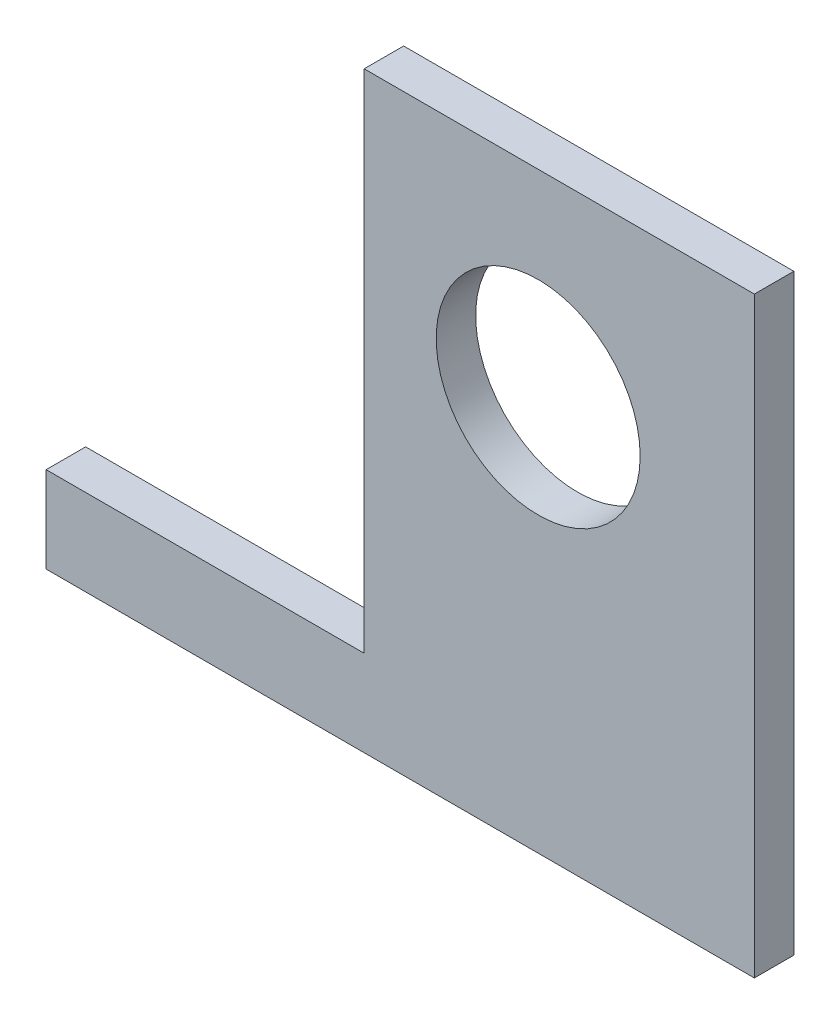
ISO-10303-21;
HEADER;
FILE_DESCRIPTION(('STEP AP214'),'2;1');
FILE_NAME('part.step','',(''),(''),'','','');
FILE_SCHEMA(('AUTOMOTIVE_DESIGN { 1 0 10303 214 1 1 1 1 }'));
ENDSEC;
DATA;
#1=APPLICATION_CONTEXT('core data for automotive mechanical design processes');
#2=APPLICATION_PROTOCOL_DEFINITION('international standard','automotive_design',2000,#1);
#3=PRODUCT_CONTEXT('',#1,'mechanical');
#4=PRODUCT('Part','Part','',(#3));
#5=PRODUCT_RELATED_PRODUCT_CATEGORY('part','',(#4));
#6=PRODUCT_DEFINITION_FORMATION('','',#4);
#7=PRODUCT_DEFINITION_CONTEXT('part definition',#1,'design');
#8=PRODUCT_DEFINITION('design','',#6,#7);
#9=PRODUCT_DEFINITION_SHAPE('','',#8);
#10=(LENGTH_UNIT() NAMED_UNIT(*) SI_UNIT(.MILLI.,.METRE.));
#11=(NAMED_UNIT(*) PLANE_ANGLE_UNIT() SI_UNIT($,.RADIAN.));
#12=(NAMED_UNIT(*) SI_UNIT($,.STERADIAN.) SOLID_ANGLE_UNIT());
#13=UNCERTAINTY_MEASURE_WITH_UNIT(LENGTH_MEASURE(1.E-05),#10,'distance_accuracy_value','');
#14=(GEOMETRIC_REPRESENTATION_CONTEXT(3) GLOBAL_UNCERTAINTY_ASSIGNED_CONTEXT((#13)) GLOBAL_UNIT_ASSIGNED_CONTEXT((#10,
#11,#12)) REPRESENTATION_CONTEXT('',''));
#15=CARTESIAN_POINT('',(0.,0.,0.));
#16=DIRECTION('',(0.,0.,1.));
#17=DIRECTION('',(1.,0.,0.));
#18=AXIS2_PLACEMENT_3D('',#15,#16,#17);
#19=CARTESIAN_POINT('',(250.,-75.,10.));
#20=DIRECTION('',(0.,1.,0.));
#21=DIRECTION('',(-1.,0.,0.));
#22=AXIS2_PLACEMENT_3D('',#19,#20,#21);
#23=PLANE('',#22);
#24=DIRECTION('',(1.,0.,0.));
#25=VECTOR('',#24,1.);
#26=CARTESIAN_POINT('',(250.,-75.,10.));
#27=LINE('',#26,#25);
#28=CARTESIAN_POINT('',(70.6570660952871,-75.,10.));
#29=VERTEX_POINT('',#28);
#30=CARTESIAN_POINT('',(250.,-75.,10.));
#31=VERTEX_POINT('',#30);
#32=EDGE_CURVE('E94',#29,#31,#27,.T.);
#33=ORIENTED_EDGE('',*,*,#32,.F.);
#34=DIRECTION('',(0.,0.,1.));
#35=VECTOR('',#34,1.);
#36=CARTESIAN_POINT('',(70.6570660952871,-75.,0.));
#37=LINE('',#36,#35);
#38=CARTESIAN_POINT('',(70.6570660952871,-75.,0.));
#39=VERTEX_POINT('',#38);
#40=EDGE_CURVE('E86',#39,#29,#37,.T.);
#41=ORIENTED_EDGE('',*,*,#40,.F.);
#42=DIRECTION('',(1.,0.,0.));
#43=VECTOR('',#42,1.);
#44=CARTESIAN_POINT('',(250.,-75.,0.));
#45=LINE('',#44,#43);
#46=CARTESIAN_POINT('',(250.,-75.,0.));
#47=VERTEX_POINT('',#46);
#48=EDGE_CURVE('E92',#39,#47,#45,.T.);
#49=ORIENTED_EDGE('',*,*,#48,.T.);
#50=DIRECTION('',(0.,0.,-1.));
#51=VECTOR('',#50,1.);
#52=CARTESIAN_POINT('',(250.,-75.,10.));
#53=LINE('',#52,#51);
#54=EDGE_CURVE('E40',#31,#47,#53,.T.);
#55=ORIENTED_EDGE('',*,*,#54,.F.);
#56=EDGE_LOOP('',(#33,#41,#49,#55));
#57=FACE_BOUND('',#56,.T.);
#58=ADVANCED_FACE('F33',(#57),#23,.F.);
#59=CARTESIAN_POINT('',(250.,-75.,10.));
#60=DIRECTION('',(-1.,0.,0.));
#61=DIRECTION('',(0.,0.,1.));
#62=AXIS2_PLACEMENT_3D('',#59,#60,#61);
#63=PLANE('',#62);
#64=DIRECTION('',(0.,1.,0.));
#65=VECTOR('',#64,1.);
#66=CARTESIAN_POINT('',(250.,-75.,0.));
#67=LINE('',#66,#65);
#68=CARTESIAN_POINT('',(250.,75.,0.));
#69=VERTEX_POINT('',#68);
#70=EDGE_CURVE('E100',#47,#69,#67,.T.);
#71=ORIENTED_EDGE('',*,*,#70,.T.);
#72=DIRECTION('',(0.,0.,-1.));
#73=VECTOR('',#72,1.);
#74=CARTESIAN_POINT('',(250.,75.,10.));
#75=LINE('',#74,#73);
#76=CARTESIAN_POINT('',(250.,75.,10.));
#77=VERTEX_POINT('',#76);
#78=EDGE_CURVE('E114',#77,#69,#75,.T.);
#79=ORIENTED_EDGE('',*,*,#78,.F.);
#80=DIRECTION('',(0.,1.,0.));
#81=VECTOR('',#80,1.);
#82=CARTESIAN_POINT('',(250.,-75.,10.));
#83=LINE('',#82,#81);
#84=EDGE_CURVE('E120',#31,#77,#83,.T.);
#85=ORIENTED_EDGE('',*,*,#84,.F.);
#86=ORIENTED_EDGE('',*,*,#54,.T.);
#87=EDGE_LOOP('',(#71,#79,#85,#86));
#88=FACE_BOUND('',#87,.T.);
#89=ADVANCED_FACE('F118',(#88),#63,.F.);
#90=CARTESIAN_POINT('',(250.,75.,10.));
#91=DIRECTION('',(0.,-1.,0.));
#92=DIRECTION('',(1.,0.,0.));
#93=AXIS2_PLACEMENT_3D('',#90,#91,#92);
#94=PLANE('',#93);
#95=DIRECTION('',(-1.,0.,0.));
#96=VECTOR('',#95,1.);
#97=CARTESIAN_POINT('',(250.,75.,0.));
#98=LINE('',#97,#96);
#99=CARTESIAN_POINT('',(151.190926375937,75.,0.));
#100=VERTEX_POINT('',#99);
#101=EDGE_CURVE('E103',#69,#100,#98,.T.);
#102=ORIENTED_EDGE('',*,*,#101,.T.);
#103=DIRECTION('',(0.,0.,1.));
#104=VECTOR('',#103,1.);
#105=CARTESIAN_POINT('',(151.190926375937,75.,0.));
#106=LINE('',#105,#104);
#107=CARTESIAN_POINT('',(151.190926375937,75.,10.));
#108=VERTEX_POINT('',#107);
#109=EDGE_CURVE('E127',#100,#108,#106,.T.);
#110=ORIENTED_EDGE('',*,*,#109,.T.);
#111=DIRECTION('',(-1.,0.,0.));
#112=VECTOR('',#111,1.);
#113=CARTESIAN_POINT('',(250.,75.,10.));
#114=LINE('',#113,#112);
#115=EDGE_CURVE('E109',#77,#108,#114,.T.);
#116=ORIENTED_EDGE('',*,*,#115,.F.);
#117=ORIENTED_EDGE('',*,*,#78,.T.);
#118=EDGE_LOOP('',(#102,#110,#116,#117));
#119=FACE_BOUND('',#118,.T.);
#120=ADVANCED_FACE('F143',(#119),#94,.F.);
#121=CARTESIAN_POINT('',(0.,0.,10.));
#122=DIRECTION('',(0.,0.,1.));
#123=DIRECTION('',(1.,0.,0.));
#124=AXIS2_PLACEMENT_3D('',#121,#122,#123);
#125=PLANE('',#124);
#126=DIRECTION('',(0.,1.,0.));
#127=VECTOR('',#126,1.);
#128=CARTESIAN_POINT('',(70.6570660952871,-31.3654758423676,10.));
#129=LINE('',#128,#127);
#130=CARTESIAN_POINT('',(70.6570660952872,-53.1827379211838,10.));
#131=VERTEX_POINT('',#130);
#132=EDGE_CURVE('E47',#29,#131,#129,.T.);
#133=ORIENTED_EDGE('',*,*,#132,.F.);
#134=ORIENTED_EDGE('',*,*,#32,.T.);
#135=ORIENTED_EDGE('',*,*,#84,.T.);
#136=ORIENTED_EDGE('',*,*,#115,.T.);
#137=DIRECTION('',(0.,1.,0.));
#138=VECTOR('',#137,1.);
#139=CARTESIAN_POINT('',(151.190926375937,75.,10.));
#140=LINE('',#139,#138);
#141=CARTESIAN_POINT('',(151.190926375937,-53.1827379211838,10.));
#142=VERTEX_POINT('',#141);
#143=EDGE_CURVE('E135',#142,#108,#140,.T.);
#144=ORIENTED_EDGE('',*,*,#143,.F.);
#145=DIRECTION('',(1.,0.,0.));
#146=VECTOR('',#145,1.);
#147=CARTESIAN_POINT('',(-250.,-53.1827379211838,10.));
#148=LINE('',#147,#146);
#149=EDGE_CURVE('E95',#131,#142,#148,.T.);
#150=ORIENTED_EDGE('',*,*,#149,.F.);
#151=EDGE_LOOP('',(#133,#134,#135,#136,#144,#150));
#152=FACE_BOUND('',#151,.T.);
#153=CARTESIAN_POINT('',(195.256623510632,25.,10.));
#154=DIRECTION('',(0.,0.,1.));
#155=DIRECTION('',(1.,0.,0.));
#156=AXIS2_PLACEMENT_3D('',#153,#154,#155);
#157=CIRCLE('',#156,25.8316155617179);
#158=CARTESIAN_POINT('',(221.08823907235,25.,10.));
#159=VERTEX_POINT('',#158);
#160=EDGE_CURVE('E106',#159,#159,#157,.T.);
#161=ORIENTED_EDGE('',*,*,#160,.F.);
#162=EDGE_LOOP('',(#161));
#163=FACE_BOUND('',#162,.T.);
#164=ADVANCED_FACE('F145',(#152,#163),#125,.T.);
#165=CARTESIAN_POINT('',(0.,0.,0.));
#166=DIRECTION('',(0.,0.,1.));
#167=DIRECTION('',(1.,0.,0.));
#168=AXIS2_PLACEMENT_3D('',#165,#166,#167);
#169=PLANE('',#168);
#170=CARTESIAN_POINT('',(195.256623510632,25.,0.));
#171=DIRECTION('',(0.,0.,1.));
#172=DIRECTION('',(1.,0.,0.));
#173=AXIS2_PLACEMENT_3D('',#170,#171,#172);
#174=CIRCLE('',#173,25.8316155617179);
#175=CARTESIAN_POINT('',(221.08823907235,25.,0.));
#176=VERTEX_POINT('',#175);
#177=EDGE_CURVE('E101',#176,#176,#174,.T.);
#178=ORIENTED_EDGE('',*,*,#177,.T.);
#179=EDGE_LOOP('',(#178));
#180=FACE_BOUND('',#179,.T.);
#181=ORIENTED_EDGE('',*,*,#48,.F.);
#182=DIRECTION('',(0.,1.,0.));
#183=VECTOR('',#182,1.);
#184=CARTESIAN_POINT('',(70.6570660952871,-31.3654758423676,0.));
#185=LINE('',#184,#183);
#186=CARTESIAN_POINT('',(70.6570660952871,-53.1827379211838,0.));
#187=VERTEX_POINT('',#186);
#188=EDGE_CURVE('E83',#39,#187,#185,.T.);
#189=ORIENTED_EDGE('',*,*,#188,.T.);
#190=DIRECTION('',(1.,0.,0.));
#191=VECTOR('',#190,1.);
#192=CARTESIAN_POINT('',(-250.,-53.1827379211838,0.));
#193=LINE('',#192,#191);
#194=CARTESIAN_POINT('',(151.190926375937,-53.1827379211838,0.));
#195=VERTEX_POINT('',#194);
#196=EDGE_CURVE('E54',#187,#195,#193,.T.);
#197=ORIENTED_EDGE('',*,*,#196,.T.);
#198=DIRECTION('',(0.,1.,0.));
#199=VECTOR('',#198,1.);
#200=CARTESIAN_POINT('',(151.190926375937,75.,0.));
#201=LINE('',#200,#199);
#202=EDGE_CURVE('E132',#195,#100,#201,.T.);
#203=ORIENTED_EDGE('',*,*,#202,.T.);
#204=ORIENTED_EDGE('',*,*,#101,.F.);
#205=ORIENTED_EDGE('',*,*,#70,.F.);
#206=EDGE_LOOP('',(#181,#189,#197,#203,#204,#205));
#207=FACE_BOUND('',#206,.T.);
#208=ADVANCED_FACE('F98',(#180,#207),#169,.F.);
#209=CARTESIAN_POINT('',(195.256623510632,25.,0.));
#210=DIRECTION('',(0.,0.,1.));
#211=DIRECTION('',(1.,0.,0.));
#212=AXIS2_PLACEMENT_3D('',#209,#210,#211);
#213=CYLINDRICAL_SURFACE('',#212,25.8316155617179);
#214=ORIENTED_EDGE('',*,*,#177,.F.);
#215=EDGE_LOOP('',(#214));
#216=FACE_BOUND('',#215,.T.);
#217=ORIENTED_EDGE('',*,*,#160,.T.);
#218=EDGE_LOOP('',(#217));
#219=FACE_BOUND('',#218,.T.);
#220=ADVANCED_FACE('F158',(#216,#219),#213,.F.);
#221=CARTESIAN_POINT('',(151.190926375937,75.,0.));
#222=DIRECTION('',(1.,0.,0.));
#223=DIRECTION('',(0.,0.,-1.));
#224=AXIS2_PLACEMENT_3D('',#221,#222,#223);
#225=PLANE('',#224);
#226=ORIENTED_EDGE('',*,*,#143,.T.);
#227=ORIENTED_EDGE('',*,*,#109,.F.);
#228=ORIENTED_EDGE('',*,*,#202,.F.);
#229=DIRECTION('',(0.,0.,1.));
#230=VECTOR('',#229,1.);
#231=CARTESIAN_POINT('',(151.190926375937,-53.1827379211838,0.));
#232=LINE('',#231,#230);
#233=EDGE_CURVE('E129',#195,#142,#232,.T.);
#234=ORIENTED_EDGE('',*,*,#233,.T.);
#235=EDGE_LOOP('',(#226,#227,#228,#234));
#236=FACE_BOUND('',#235,.T.);
#237=ADVANCED_FACE('F148',(#236),#225,.F.);
#238=CARTESIAN_POINT('',(-250.,-53.1827379211838,0.));
#239=DIRECTION('',(0.,-1.,0.));
#240=DIRECTION('',(0.,0.,-1.));
#241=AXIS2_PLACEMENT_3D('',#238,#239,#240);
#242=PLANE('',#241);
#243=ORIENTED_EDGE('',*,*,#196,.F.);
#244=DIRECTION('',(0.,0.,1.));
#245=VECTOR('',#244,1.);
#246=CARTESIAN_POINT('',(70.6570660952871,-53.1827379211838,0.));
#247=LINE('',#246,#245);
#248=EDGE_CURVE('E11',#187,#131,#247,.T.);
#249=ORIENTED_EDGE('',*,*,#248,.T.);
#250=ORIENTED_EDGE('',*,*,#149,.T.);
#251=ORIENTED_EDGE('',*,*,#233,.F.);
#252=EDGE_LOOP('',(#243,#249,#250,#251));
#253=FACE_BOUND('',#252,.T.);
#254=ADVANCED_FACE('F150',(#253),#242,.F.);
#255=CARTESIAN_POINT('',(70.6570660952871,-31.3654758423676,0.));
#256=DIRECTION('',(1.,0.,0.));
#257=DIRECTION('',(0.,0.,-1.));
#258=AXIS2_PLACEMENT_3D('',#255,#256,#257);
#259=PLANE('',#258);
#260=ORIENTED_EDGE('',*,*,#188,.F.);
#261=ORIENTED_EDGE('',*,*,#40,.T.);
#262=ORIENTED_EDGE('',*,*,#132,.T.);
#263=ORIENTED_EDGE('',*,*,#248,.F.);
#264=EDGE_LOOP('',(#260,#261,#262,#263));
#265=FACE_BOUND('',#264,.T.);
#266=ADVANCED_FACE('F85',(#265),#259,.F.);
#267=CLOSED_SHELL('',(#58,#89,#120,#164,#208,#220,#237,#254,#266));
#268=MANIFOLD_SOLID_BREP('B2',#267);
#269=ADVANCED_BREP_SHAPE_REPRESENTATION('',(#18,#268),#14);
#270=SHAPE_DEFINITION_REPRESENTATION(#9,#269);
ENDSEC;
END-ISO-10303-21;
